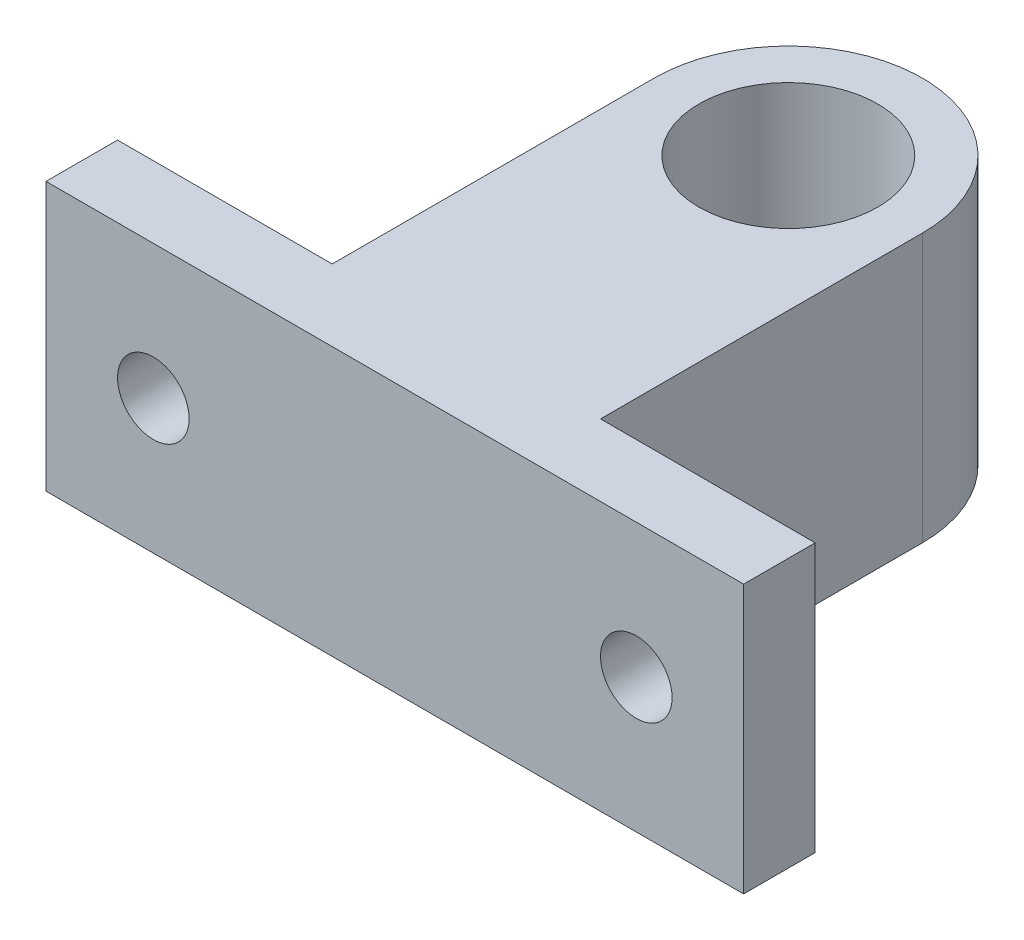
ISO-10303-21;
HEADER;
FILE_DESCRIPTION(('STEP AP214'),'2;1');
FILE_NAME('part.step','',(''),(''),'','','');
FILE_SCHEMA(('AUTOMOTIVE_DESIGN { 1 0 10303 214 1 1 1 1 }'));
ENDSEC;
DATA;
#1=APPLICATION_CONTEXT('core data for automotive mechanical design processes');
#2=APPLICATION_PROTOCOL_DEFINITION('international standard','automotive_design',2000,#1);
#3=PRODUCT_CONTEXT('',#1,'mechanical');
#4=PRODUCT('Part','Part','',(#3));
#5=PRODUCT_RELATED_PRODUCT_CATEGORY('part','',(#4));
#6=PRODUCT_DEFINITION_FORMATION('','',#4);
#7=PRODUCT_DEFINITION_CONTEXT('part definition',#1,'design');
#8=PRODUCT_DEFINITION('design','',#6,#7);
#9=PRODUCT_DEFINITION_SHAPE('','',#8);
#10=(LENGTH_UNIT() NAMED_UNIT(*) SI_UNIT(.MILLI.,.METRE.));
#11=(NAMED_UNIT(*) PLANE_ANGLE_UNIT() SI_UNIT($,.RADIAN.));
#12=(NAMED_UNIT(*) SI_UNIT($,.STERADIAN.) SOLID_ANGLE_UNIT());
#13=UNCERTAINTY_MEASURE_WITH_UNIT(LENGTH_MEASURE(1.E-05),#10,'distance_accuracy_value','');
#14=(GEOMETRIC_REPRESENTATION_CONTEXT(3) GLOBAL_UNCERTAINTY_ASSIGNED_CONTEXT((#13)) GLOBAL_UNIT_ASSIGNED_CONTEXT((#10,
#11,#12)) REPRESENTATION_CONTEXT('',''));
#15=CARTESIAN_POINT('',(0.,0.,0.));
#16=DIRECTION('',(0.,0.,1.));
#17=DIRECTION('',(1.,0.,0.));
#18=AXIS2_PLACEMENT_3D('',#15,#16,#17);
#19=CARTESIAN_POINT('',(10.,15.,-22.));
#20=DIRECTION('',(0.,-1.,0.));
#21=DIRECTION('',(0.,0.,-1.));
#22=AXIS2_PLACEMENT_3D('',#19,#20,#21);
#23=CYLINDRICAL_SURFACE('',#22,7.5);
#24=CARTESIAN_POINT('',(10.,0.,-22.));
#25=DIRECTION('',(0.,1.,0.));
#26=DIRECTION('',(0.,0.,1.));
#27=AXIS2_PLACEMENT_3D('',#24,#25,#26);
#28=CIRCLE('',#27,7.5);
#29=CARTESIAN_POINT('',(17.5,0.,-22.));
#30=VERTEX_POINT('',#29);
#31=CARTESIAN_POINT('',(2.5,0.,-22.));
#32=VERTEX_POINT('',#31);
#33=EDGE_CURVE('E160',#30,#32,#28,.T.);
#34=ORIENTED_EDGE('',*,*,#33,.T.);
#35=DIRECTION('',(0.,-1.,0.));
#36=VECTOR('',#35,1.);
#37=CARTESIAN_POINT('',(2.5,15.,-22.));
#38=LINE('',#37,#36);
#39=CARTESIAN_POINT('',(2.5,15.,-22.));
#40=VERTEX_POINT('',#39);
#41=EDGE_CURVE('E11',#40,#32,#38,.T.);
#42=ORIENTED_EDGE('',*,*,#41,.F.);
#43=CARTESIAN_POINT('',(10.,15.,-22.));
#44=DIRECTION('',(0.,1.,0.));
#45=DIRECTION('',(0.,0.,1.));
#46=AXIS2_PLACEMENT_3D('',#43,#44,#45);
#47=CIRCLE('',#46,7.5);
#48=CARTESIAN_POINT('',(17.5,15.,-22.));
#49=VERTEX_POINT('',#48);
#50=EDGE_CURVE('E161',#49,#40,#47,.T.);
#51=ORIENTED_EDGE('',*,*,#50,.F.);
#52=DIRECTION('',(0.,-1.,0.));
#53=VECTOR('',#52,1.);
#54=CARTESIAN_POINT('',(17.5,15.,-22.));
#55=LINE('',#54,#53);
#56=EDGE_CURVE('E50',#49,#30,#55,.T.);
#57=ORIENTED_EDGE('',*,*,#56,.T.);
#58=EDGE_LOOP('',(#34,#42,#51,#57));
#59=FACE_BOUND('',#58,.T.);
#60=ADVANCED_FACE('F42',(#59),#23,.T.);
#61=CARTESIAN_POINT('',(2.5,15.,0.));
#62=DIRECTION('',(1.,0.,0.));
#63=DIRECTION('',(0.,0.,-1.));
#64=AXIS2_PLACEMENT_3D('',#61,#62,#63);
#65=PLANE('',#64);
#66=DIRECTION('',(0.,0.,1.));
#67=VECTOR('',#66,1.);
#68=CARTESIAN_POINT('',(2.5,0.,0.));
#69=LINE('',#68,#67);
#70=CARTESIAN_POINT('',(2.5,0.,-4.));
#71=VERTEX_POINT('',#70);
#72=EDGE_CURVE('E62',#32,#71,#69,.T.);
#73=ORIENTED_EDGE('',*,*,#72,.T.);
#74=DIRECTION('',(0.,1.,0.));
#75=VECTOR('',#74,1.);
#76=CARTESIAN_POINT('',(2.5,15.,-4.));
#77=LINE('',#76,#75);
#78=CARTESIAN_POINT('',(2.5,15.,-4.));
#79=VERTEX_POINT('',#78);
#80=EDGE_CURVE('E58',#71,#79,#77,.T.);
#81=ORIENTED_EDGE('',*,*,#80,.T.);
#82=DIRECTION('',(0.,0.,1.));
#83=VECTOR('',#82,1.);
#84=CARTESIAN_POINT('',(2.5,15.,0.));
#85=LINE('',#84,#83);
#86=EDGE_CURVE('E164',#40,#79,#85,.T.);
#87=ORIENTED_EDGE('',*,*,#86,.F.);
#88=ORIENTED_EDGE('',*,*,#41,.T.);
#89=EDGE_LOOP('',(#73,#81,#87,#88));
#90=FACE_BOUND('',#89,.T.);
#91=ADVANCED_FACE('F195',(#90),#65,.F.);
#92=CARTESIAN_POINT('',(0.,15.,0.));
#93=DIRECTION('',(0.,0.,-1.));
#94=DIRECTION('',(-1.,0.,0.));
#95=AXIS2_PLACEMENT_3D('',#92,#93,#94);
#96=PLANE('',#95);
#97=CARTESIAN_POINT('',(-3.5,7.5,0.));
#98=DIRECTION('',(0.,0.,1.));
#99=DIRECTION('',(1.,0.,0.));
#100=AXIS2_PLACEMENT_3D('',#97,#98,#99);
#101=CIRCLE('',#100,2.);
#102=CARTESIAN_POINT('',(-1.5,7.5,0.));
#103=VERTEX_POINT('',#102);
#104=EDGE_CURVE('E182',#103,#103,#101,.T.);
#105=ORIENTED_EDGE('',*,*,#104,.F.);
#106=EDGE_LOOP('',(#105));
#107=FACE_BOUND('',#106,.T.);
#108=CARTESIAN_POINT('',(23.5,7.5,0.));
#109=DIRECTION('',(0.,0.,1.));
#110=DIRECTION('',(1.,0.,0.));
#111=AXIS2_PLACEMENT_3D('',#108,#109,#110);
#112=CIRCLE('',#111,2.);
#113=CARTESIAN_POINT('',(25.5,7.5,0.));
#114=VERTEX_POINT('',#113);
#115=EDGE_CURVE('E136',#114,#114,#112,.T.);
#116=ORIENTED_EDGE('',*,*,#115,.F.);
#117=EDGE_LOOP('',(#116));
#118=FACE_BOUND('',#117,.T.);
#119=DIRECTION('',(1.,0.,0.));
#120=VECTOR('',#119,1.);
#121=CARTESIAN_POINT('',(0.,0.,0.));
#122=LINE('',#121,#120);
#123=CARTESIAN_POINT('',(-9.5,0.,0.));
#124=VERTEX_POINT('',#123);
#125=CARTESIAN_POINT('',(29.5,0.,0.));
#126=VERTEX_POINT('',#125);
#127=EDGE_CURVE('E105',#124,#126,#122,.T.);
#128=ORIENTED_EDGE('',*,*,#127,.T.);
#129=DIRECTION('',(0.,-1.,0.));
#130=VECTOR('',#129,1.);
#131=CARTESIAN_POINT('',(29.5,15.,0.));
#132=LINE('',#131,#130);
#133=CARTESIAN_POINT('',(29.5,15.,0.));
#134=VERTEX_POINT('',#133);
#135=EDGE_CURVE('E109',#134,#126,#132,.T.);
#136=ORIENTED_EDGE('',*,*,#135,.F.);
#137=DIRECTION('',(1.,0.,0.));
#138=VECTOR('',#137,1.);
#139=CARTESIAN_POINT('',(0.,15.,0.));
#140=LINE('',#139,#138);
#141=CARTESIAN_POINT('',(-9.5,15.,0.));
#142=VERTEX_POINT('',#141);
#143=EDGE_CURVE('E167',#142,#134,#140,.T.);
#144=ORIENTED_EDGE('',*,*,#143,.F.);
#145=DIRECTION('',(0.,-1.,0.));
#146=VECTOR('',#145,1.);
#147=CARTESIAN_POINT('',(-9.5,15.,0.));
#148=LINE('',#147,#146);
#149=EDGE_CURVE('E111',#142,#124,#148,.T.);
#150=ORIENTED_EDGE('',*,*,#149,.T.);
#151=EDGE_LOOP('',(#128,#136,#144,#150));
#152=FACE_BOUND('',#151,.T.);
#153=ADVANCED_FACE('F107',(#107,#118,#152),#96,.F.);
#154=CARTESIAN_POINT('',(17.5,15.,0.));
#155=DIRECTION('',(1.,0.,0.));
#156=DIRECTION('',(0.,0.,-1.));
#157=AXIS2_PLACEMENT_3D('',#154,#155,#156);
#158=PLANE('',#157);
#159=DIRECTION('',(0.,1.,0.));
#160=VECTOR('',#159,1.);
#161=CARTESIAN_POINT('',(17.5,15.,-4.));
#162=LINE('',#161,#160);
#163=CARTESIAN_POINT('',(17.5,0.,-4.));
#164=VERTEX_POINT('',#163);
#165=CARTESIAN_POINT('',(17.5,15.,-4.));
#166=VERTEX_POINT('',#165);
#167=EDGE_CURVE('E153',#164,#166,#162,.T.);
#168=ORIENTED_EDGE('',*,*,#167,.F.);
#169=DIRECTION('',(0.,0.,1.));
#170=VECTOR('',#169,1.);
#171=CARTESIAN_POINT('',(17.5,0.,0.));
#172=LINE('',#171,#170);
#173=EDGE_CURVE('E115',#30,#164,#172,.T.);
#174=ORIENTED_EDGE('',*,*,#173,.F.);
#175=ORIENTED_EDGE('',*,*,#56,.F.);
#176=DIRECTION('',(0.,0.,1.));
#177=VECTOR('',#176,1.);
#178=CARTESIAN_POINT('',(17.5,15.,0.));
#179=LINE('',#178,#177);
#180=EDGE_CURVE('E169',#49,#166,#179,.T.);
#181=ORIENTED_EDGE('',*,*,#180,.T.);
#182=EDGE_LOOP('',(#168,#174,#175,#181));
#183=FACE_BOUND('',#182,.T.);
#184=ADVANCED_FACE('F194',(#183),#158,.T.);
#185=CARTESIAN_POINT('',(10.,15.,-22.));
#186=DIRECTION('',(0.,-1.,0.));
#187=DIRECTION('',(0.,0.,-1.));
#188=AXIS2_PLACEMENT_3D('',#185,#186,#187);
#189=CYLINDRICAL_SURFACE('',#188,5.);
#190=CARTESIAN_POINT('',(10.,15.,-22.));
#191=DIRECTION('',(0.,1.,0.));
#192=DIRECTION('',(0.,0.,1.));
#193=AXIS2_PLACEMENT_3D('',#190,#191,#192);
#194=CIRCLE('',#193,5.);
#195=CARTESIAN_POINT('',(10.,15.,-17.));
#196=VERTEX_POINT('',#195);
#197=EDGE_CURVE('E172',#196,#196,#194,.T.);
#198=ORIENTED_EDGE('',*,*,#197,.T.);
#199=EDGE_LOOP('',(#198));
#200=FACE_BOUND('',#199,.T.);
#201=CARTESIAN_POINT('',(10.,0.,-22.));
#202=DIRECTION('',(0.,1.,0.));
#203=DIRECTION('',(0.,0.,1.));
#204=AXIS2_PLACEMENT_3D('',#201,#202,#203);
#205=CIRCLE('',#204,5.);
#206=CARTESIAN_POINT('',(10.,0.,-17.));
#207=VERTEX_POINT('',#206);
#208=EDGE_CURVE('E165',#207,#207,#205,.T.);
#209=ORIENTED_EDGE('',*,*,#208,.F.);
#210=EDGE_LOOP('',(#209));
#211=FACE_BOUND('',#210,.T.);
#212=ADVANCED_FACE('F202',(#200,#211),#189,.F.);
#213=CARTESIAN_POINT('',(0.,15.,0.));
#214=DIRECTION('',(0.,1.,0.));
#215=DIRECTION('',(0.,0.,1.));
#216=AXIS2_PLACEMENT_3D('',#213,#214,#215);
#217=PLANE('',#216);
#218=ORIENTED_EDGE('',*,*,#86,.T.);
#219=DIRECTION('',(1.,0.,0.));
#220=VECTOR('',#219,1.);
#221=CARTESIAN_POINT('',(-9.5,15.,-4.));
#222=LINE('',#221,#220);
#223=CARTESIAN_POINT('',(-9.5,15.,-4.));
#224=VERTEX_POINT('',#223);
#225=EDGE_CURVE('E150',#224,#79,#222,.T.);
#226=ORIENTED_EDGE('',*,*,#225,.F.);
#227=DIRECTION('',(0.,0.,1.));
#228=VECTOR('',#227,1.);
#229=CARTESIAN_POINT('',(-9.5,15.,0.));
#230=LINE('',#229,#228);
#231=EDGE_CURVE('E147',#224,#142,#230,.T.);
#232=ORIENTED_EDGE('',*,*,#231,.T.);
#233=ORIENTED_EDGE('',*,*,#143,.T.);
#234=DIRECTION('',(0.,0.,1.));
#235=VECTOR('',#234,1.);
#236=CARTESIAN_POINT('',(29.5,15.,0.));
#237=LINE('',#236,#235);
#238=CARTESIAN_POINT('',(29.5,15.,-4.));
#239=VERTEX_POINT('',#238);
#240=EDGE_CURVE('E131',#239,#134,#237,.T.);
#241=ORIENTED_EDGE('',*,*,#240,.F.);
#242=EDGE_CURVE('E154',#166,#239,#222,.T.);
#243=ORIENTED_EDGE('',*,*,#242,.F.);
#244=ORIENTED_EDGE('',*,*,#180,.F.);
#245=ORIENTED_EDGE('',*,*,#50,.T.);
#246=EDGE_LOOP('',(#218,#226,#232,#233,#241,#243,#244,#245));
#247=FACE_BOUND('',#246,.T.);
#248=ORIENTED_EDGE('',*,*,#197,.F.);
#249=EDGE_LOOP('',(#248));
#250=FACE_BOUND('',#249,.T.);
#251=ADVANCED_FACE('F219',(#247,#250),#217,.T.);
#252=CARTESIAN_POINT('',(0.,0.,0.));
#253=DIRECTION('',(0.,1.,0.));
#254=DIRECTION('',(0.,0.,1.));
#255=AXIS2_PLACEMENT_3D('',#252,#253,#254);
#256=PLANE('',#255);
#257=ORIENTED_EDGE('',*,*,#173,.T.);
#258=DIRECTION('',(1.,0.,0.));
#259=VECTOR('',#258,1.);
#260=CARTESIAN_POINT('',(-9.5,0.,-4.));
#261=LINE('',#260,#259);
#262=CARTESIAN_POINT('',(29.5,0.,-4.));
#263=VERTEX_POINT('',#262);
#264=EDGE_CURVE('E122',#164,#263,#261,.T.);
#265=ORIENTED_EDGE('',*,*,#264,.T.);
#266=DIRECTION('',(0.,0.,-1.));
#267=VECTOR('',#266,1.);
#268=CARTESIAN_POINT('',(29.5,0.,0.));
#269=LINE('',#268,#267);
#270=EDGE_CURVE('E118',#126,#263,#269,.T.);
#271=ORIENTED_EDGE('',*,*,#270,.F.);
#272=ORIENTED_EDGE('',*,*,#127,.F.);
#273=DIRECTION('',(0.,0.,-1.));
#274=VECTOR('',#273,1.);
#275=CARTESIAN_POINT('',(-9.5,0.,0.));
#276=LINE('',#275,#274);
#277=CARTESIAN_POINT('',(-9.5,0.,-4.));
#278=VERTEX_POINT('',#277);
#279=EDGE_CURVE('E142',#124,#278,#276,.T.);
#280=ORIENTED_EDGE('',*,*,#279,.T.);
#281=EDGE_CURVE('E155',#278,#71,#261,.T.);
#282=ORIENTED_EDGE('',*,*,#281,.T.);
#283=ORIENTED_EDGE('',*,*,#72,.F.);
#284=ORIENTED_EDGE('',*,*,#33,.F.);
#285=EDGE_LOOP('',(#257,#265,#271,#272,#280,#282,#283,#284));
#286=FACE_BOUND('',#285,.T.);
#287=ORIENTED_EDGE('',*,*,#208,.T.);
#288=EDGE_LOOP('',(#287));
#289=FACE_BOUND('',#288,.T.);
#290=ADVANCED_FACE('F120',(#286,#289),#256,.F.);
#291=CARTESIAN_POINT('',(29.5,0.,0.));
#292=DIRECTION('',(1.,0.,0.));
#293=DIRECTION('',(0.,0.,-1.));
#294=AXIS2_PLACEMENT_3D('',#291,#292,#293);
#295=PLANE('',#294);
#296=ORIENTED_EDGE('',*,*,#135,.T.);
#297=ORIENTED_EDGE('',*,*,#270,.T.);
#298=DIRECTION('',(0.,1.,0.));
#299=VECTOR('',#298,1.);
#300=CARTESIAN_POINT('',(29.5,15.,-4.));
#301=LINE('',#300,#299);
#302=EDGE_CURVE('E126',#263,#239,#301,.T.);
#303=ORIENTED_EDGE('',*,*,#302,.T.);
#304=ORIENTED_EDGE('',*,*,#240,.T.);
#305=EDGE_LOOP('',(#296,#297,#303,#304));
#306=FACE_BOUND('',#305,.T.);
#307=ADVANCED_FACE('F129',(#306),#295,.T.);
#308=CARTESIAN_POINT('',(-9.5,15.,-4.));
#309=DIRECTION('',(0.,0.,-1.));
#310=DIRECTION('',(0.,1.,0.));
#311=AXIS2_PLACEMENT_3D('',#308,#309,#310);
#312=PLANE('',#311);
#313=CARTESIAN_POINT('',(23.5,7.5,-4.));
#314=DIRECTION('',(0.,0.,-1.));
#315=DIRECTION('',(0.,1.,0.));
#316=AXIS2_PLACEMENT_3D('',#313,#314,#315);
#317=CIRCLE('',#316,2.);
#318=CARTESIAN_POINT('',(23.5,9.5,-4.));
#319=VERTEX_POINT('',#318);
#320=EDGE_CURVE('E45',#319,#319,#317,.T.);
#321=ORIENTED_EDGE('',*,*,#320,.F.);
#322=EDGE_LOOP('',(#321));
#323=FACE_BOUND('',#322,.T.);
#324=ORIENTED_EDGE('',*,*,#264,.F.);
#325=ORIENTED_EDGE('',*,*,#167,.T.);
#326=ORIENTED_EDGE('',*,*,#242,.T.);
#327=ORIENTED_EDGE('',*,*,#302,.F.);
#328=EDGE_LOOP('',(#324,#325,#326,#327));
#329=FACE_BOUND('',#328,.T.);
#330=ADVANCED_FACE('F217',(#323,#329),#312,.T.);
#331=CARTESIAN_POINT('',(-3.5,7.5,-4.));
#332=DIRECTION('',(0.,0.,-1.));
#333=DIRECTION('',(0.,1.,0.));
#334=AXIS2_PLACEMENT_3D('',#331,#332,#333);
#335=CIRCLE('',#334,2.);
#336=CARTESIAN_POINT('',(-3.5,9.5,-4.));
#337=VERTEX_POINT('',#336);
#338=EDGE_CURVE('E134',#337,#337,#335,.T.);
#339=ORIENTED_EDGE('',*,*,#338,.F.);
#340=EDGE_LOOP('',(#339));
#341=FACE_BOUND('',#340,.T.);
#342=ORIENTED_EDGE('',*,*,#80,.F.);
#343=ORIENTED_EDGE('',*,*,#281,.F.);
#344=DIRECTION('',(0.,1.,0.));
#345=VECTOR('',#344,1.);
#346=CARTESIAN_POINT('',(-9.5,15.,-4.));
#347=LINE('',#346,#345);
#348=EDGE_CURVE('E144',#278,#224,#347,.T.);
#349=ORIENTED_EDGE('',*,*,#348,.T.);
#350=ORIENTED_EDGE('',*,*,#225,.T.);
#351=EDGE_LOOP('',(#342,#343,#349,#350));
#352=FACE_BOUND('',#351,.T.);
#353=ADVANCED_FACE('F226',(#341,#352),#312,.T.);
#354=CARTESIAN_POINT('',(-9.5,0.,0.));
#355=DIRECTION('',(1.,0.,0.));
#356=DIRECTION('',(0.,0.,-1.));
#357=AXIS2_PLACEMENT_3D('',#354,#355,#356);
#358=PLANE('',#357);
#359=ORIENTED_EDGE('',*,*,#149,.F.);
#360=ORIENTED_EDGE('',*,*,#231,.F.);
#361=ORIENTED_EDGE('',*,*,#348,.F.);
#362=ORIENTED_EDGE('',*,*,#279,.F.);
#363=EDGE_LOOP('',(#359,#360,#361,#362));
#364=FACE_BOUND('',#363,.T.);
#365=ADVANCED_FACE('F223',(#364),#358,.F.);
#366=CARTESIAN_POINT('',(-3.5,7.5,-12.));
#367=DIRECTION('',(0.,0.,1.));
#368=DIRECTION('',(1.,0.,0.));
#369=AXIS2_PLACEMENT_3D('',#366,#367,#368);
#370=CYLINDRICAL_SURFACE('',#369,2.);
#371=ORIENTED_EDGE('',*,*,#338,.T.);
#372=EDGE_LOOP('',(#371));
#373=FACE_BOUND('',#372,.T.);
#374=ORIENTED_EDGE('',*,*,#104,.T.);
#375=EDGE_LOOP('',(#374));
#376=FACE_BOUND('',#375,.T.);
#377=ADVANCED_FACE('F234',(#373,#376),#370,.F.);
#378=CARTESIAN_POINT('',(23.5,7.5,-12.));
#379=DIRECTION('',(0.,0.,1.));
#380=DIRECTION('',(1.,0.,0.));
#381=AXIS2_PLACEMENT_3D('',#378,#379,#380);
#382=CYLINDRICAL_SURFACE('',#381,2.);
#383=ORIENTED_EDGE('',*,*,#320,.T.);
#384=EDGE_LOOP('',(#383));
#385=FACE_BOUND('',#384,.T.);
#386=ORIENTED_EDGE('',*,*,#115,.T.);
#387=EDGE_LOOP('',(#386));
#388=FACE_BOUND('',#387,.T.);
#389=ADVANCED_FACE('F191',(#385,#388),#382,.F.);
#390=CLOSED_SHELL('',(#60,#91,#153,#184,#212,#251,#290,#307,#330,#353,#365,#377,#389));
#391=MANIFOLD_SOLID_BREP('B2',#390);
#392=ADVANCED_BREP_SHAPE_REPRESENTATION('',(#18,#391),#14);
#393=SHAPE_DEFINITION_REPRESENTATION(#9,#392);
ENDSEC;
END-ISO-10303-21;
